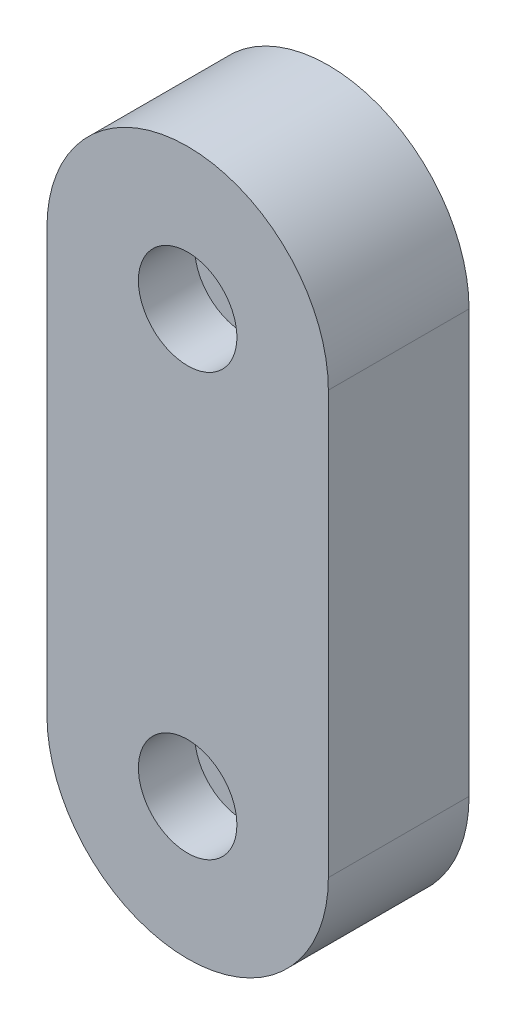
ISO-10303-21;
HEADER;
FILE_DESCRIPTION(('STEP AP214'),'2;1');
FILE_NAME('part.step','',(''),(''),'','','');
FILE_SCHEMA(('AUTOMOTIVE_DESIGN { 1 0 10303 214 1 1 1 1 }'));
ENDSEC;
DATA;
#1=APPLICATION_CONTEXT('core data for automotive mechanical design processes');
#2=APPLICATION_PROTOCOL_DEFINITION('international standard','automotive_design',2000,#1);
#3=PRODUCT_CONTEXT('',#1,'mechanical');
#4=PRODUCT('Part','Part','',(#3));
#5=PRODUCT_RELATED_PRODUCT_CATEGORY('part','',(#4));
#6=PRODUCT_DEFINITION_FORMATION('','',#4);
#7=PRODUCT_DEFINITION_CONTEXT('part definition',#1,'design');
#8=PRODUCT_DEFINITION('design','',#6,#7);
#9=PRODUCT_DEFINITION_SHAPE('','',#8);
#10=(LENGTH_UNIT() NAMED_UNIT(*) SI_UNIT(.MILLI.,.METRE.));
#11=(NAMED_UNIT(*) PLANE_ANGLE_UNIT() SI_UNIT($,.RADIAN.));
#12=(NAMED_UNIT(*) SI_UNIT($,.STERADIAN.) SOLID_ANGLE_UNIT());
#13=UNCERTAINTY_MEASURE_WITH_UNIT(LENGTH_MEASURE(1.E-05),#10,'distance_accuracy_value','');
#14=(GEOMETRIC_REPRESENTATION_CONTEXT(3) GLOBAL_UNCERTAINTY_ASSIGNED_CONTEXT((#13)) GLOBAL_UNIT_ASSIGNED_CONTEXT((#10,
#11,#12)) REPRESENTATION_CONTEXT('',''));
#15=CARTESIAN_POINT('',(0.,0.,0.));
#16=DIRECTION('',(0.,0.,1.));
#17=DIRECTION('',(1.,0.,0.));
#18=AXIS2_PLACEMENT_3D('',#15,#16,#17);
#19=CARTESIAN_POINT('',(0.,0.,10.));
#20=DIRECTION('',(0.,0.,-1.));
#21=DIRECTION('',(-1.,0.,0.));
#22=AXIS2_PLACEMENT_3D('',#19,#20,#21);
#23=CYLINDRICAL_SURFACE('',#22,10.);
#24=CARTESIAN_POINT('',(0.,0.,0.));
#25=DIRECTION('',(0.,0.,1.));
#26=DIRECTION('',(1.,0.,0.));
#27=AXIS2_PLACEMENT_3D('',#24,#25,#26);
#28=CIRCLE('',#27,10.);
#29=CARTESIAN_POINT('',(-10.,0.,0.));
#30=VERTEX_POINT('',#29);
#31=CARTESIAN_POINT('',(10.,0.,0.));
#32=VERTEX_POINT('',#31);
#33=EDGE_CURVE('E126',#30,#32,#28,.T.);
#34=ORIENTED_EDGE('',*,*,#33,.T.);
#35=DIRECTION('',(0.,0.,-1.));
#36=VECTOR('',#35,1.);
#37=CARTESIAN_POINT('',(10.,0.,10.));
#38=LINE('',#37,#36);
#39=CARTESIAN_POINT('',(10.,0.,10.));
#40=VERTEX_POINT('',#39);
#41=EDGE_CURVE('E12',#40,#32,#38,.T.);
#42=ORIENTED_EDGE('',*,*,#41,.F.);
#43=CARTESIAN_POINT('',(0.,0.,10.));
#44=DIRECTION('',(0.,0.,1.));
#45=DIRECTION('',(1.,0.,0.));
#46=AXIS2_PLACEMENT_3D('',#43,#44,#45);
#47=CIRCLE('',#46,10.);
#48=CARTESIAN_POINT('',(-10.,0.,10.));
#49=VERTEX_POINT('',#48);
#50=EDGE_CURVE('E92',#49,#40,#47,.T.);
#51=ORIENTED_EDGE('',*,*,#50,.F.);
#52=DIRECTION('',(0.,0.,-1.));
#53=VECTOR('',#52,1.);
#54=CARTESIAN_POINT('',(-10.,0.,10.));
#55=LINE('',#54,#53);
#56=EDGE_CURVE('E101',#49,#30,#55,.T.);
#57=ORIENTED_EDGE('',*,*,#56,.T.);
#58=EDGE_LOOP('',(#34,#42,#51,#57));
#59=FACE_BOUND('',#58,.T.);
#60=ADVANCED_FACE('F39',(#59),#23,.T.);
#61=CARTESIAN_POINT('',(10.,0.,10.));
#62=DIRECTION('',(-1.,0.,0.));
#63=DIRECTION('',(0.,0.,1.));
#64=AXIS2_PLACEMENT_3D('',#61,#62,#63);
#65=PLANE('',#64);
#66=DIRECTION('',(0.,1.,0.));
#67=VECTOR('',#66,1.);
#68=CARTESIAN_POINT('',(10.,0.,0.));
#69=LINE('',#68,#67);
#70=CARTESIAN_POINT('',(10.,30.,0.));
#71=VERTEX_POINT('',#70);
#72=EDGE_CURVE('E96',#32,#71,#69,.T.);
#73=ORIENTED_EDGE('',*,*,#72,.T.);
#74=DIRECTION('',(0.,0.,-1.));
#75=VECTOR('',#74,1.);
#76=CARTESIAN_POINT('',(10.,30.,10.));
#77=LINE('',#76,#75);
#78=CARTESIAN_POINT('',(10.,30.,10.));
#79=VERTEX_POINT('',#78);
#80=EDGE_CURVE('E48',#79,#71,#77,.T.);
#81=ORIENTED_EDGE('',*,*,#80,.F.);
#82=DIRECTION('',(0.,1.,0.));
#83=VECTOR('',#82,1.);
#84=CARTESIAN_POINT('',(10.,0.,10.));
#85=LINE('',#84,#83);
#86=EDGE_CURVE('E87',#40,#79,#85,.T.);
#87=ORIENTED_EDGE('',*,*,#86,.F.);
#88=ORIENTED_EDGE('',*,*,#41,.T.);
#89=EDGE_LOOP('',(#73,#81,#87,#88));
#90=FACE_BOUND('',#89,.T.);
#91=ADVANCED_FACE('F95',(#90),#65,.F.);
#92=CARTESIAN_POINT('',(0.,30.,10.));
#93=DIRECTION('',(0.,0.,-1.));
#94=DIRECTION('',(-1.,0.,0.));
#95=AXIS2_PLACEMENT_3D('',#92,#93,#94);
#96=CYLINDRICAL_SURFACE('',#95,10.);
#97=CARTESIAN_POINT('',(0.,30.,0.));
#98=DIRECTION('',(0.,0.,1.));
#99=DIRECTION('',(1.,0.,0.));
#100=AXIS2_PLACEMENT_3D('',#97,#98,#99);
#101=CIRCLE('',#100,10.);
#102=CARTESIAN_POINT('',(-10.,30.,0.));
#103=VERTEX_POINT('',#102);
#104=EDGE_CURVE('E74',#71,#103,#101,.T.);
#105=ORIENTED_EDGE('',*,*,#104,.T.);
#106=DIRECTION('',(0.,0.,-1.));
#107=VECTOR('',#106,1.);
#108=CARTESIAN_POINT('',(-10.,30.,10.));
#109=LINE('',#108,#107);
#110=CARTESIAN_POINT('',(-10.,30.,10.));
#111=VERTEX_POINT('',#110);
#112=EDGE_CURVE('E97',#111,#103,#109,.T.);
#113=ORIENTED_EDGE('',*,*,#112,.F.);
#114=CARTESIAN_POINT('',(0.,30.,10.));
#115=DIRECTION('',(0.,0.,1.));
#116=DIRECTION('',(1.,0.,0.));
#117=AXIS2_PLACEMENT_3D('',#114,#115,#116);
#118=CIRCLE('',#117,10.);
#119=EDGE_CURVE('E90',#79,#111,#118,.T.);
#120=ORIENTED_EDGE('',*,*,#119,.F.);
#121=ORIENTED_EDGE('',*,*,#80,.T.);
#122=EDGE_LOOP('',(#105,#113,#120,#121));
#123=FACE_BOUND('',#122,.T.);
#124=ADVANCED_FACE('F99',(#123),#96,.T.);
#125=CARTESIAN_POINT('',(-10.,0.,10.));
#126=DIRECTION('',(1.,0.,0.));
#127=DIRECTION('',(0.,0.,-1.));
#128=AXIS2_PLACEMENT_3D('',#125,#126,#127);
#129=PLANE('',#128);
#130=DIRECTION('',(0.,-1.,0.));
#131=VECTOR('',#130,1.);
#132=CARTESIAN_POINT('',(-10.,0.,0.));
#133=LINE('',#132,#131);
#134=EDGE_CURVE('E80',#103,#30,#133,.T.);
#135=ORIENTED_EDGE('',*,*,#134,.T.);
#136=ORIENTED_EDGE('',*,*,#56,.F.);
#137=DIRECTION('',(0.,-1.,0.));
#138=VECTOR('',#137,1.);
#139=CARTESIAN_POINT('',(-10.,0.,10.));
#140=LINE('',#139,#138);
#141=EDGE_CURVE('E57',#111,#49,#140,.T.);
#142=ORIENTED_EDGE('',*,*,#141,.F.);
#143=ORIENTED_EDGE('',*,*,#112,.T.);
#144=EDGE_LOOP('',(#135,#136,#142,#143));
#145=FACE_BOUND('',#144,.T.);
#146=ADVANCED_FACE('F170',(#145),#129,.F.);
#147=CARTESIAN_POINT('',(0.,0.,10.));
#148=DIRECTION('',(0.,0.,1.));
#149=DIRECTION('',(1.,0.,0.));
#150=AXIS2_PLACEMENT_3D('',#147,#148,#149);
#151=PLANE('',#150);
#152=CARTESIAN_POINT('',(0.,0.,10.));
#153=DIRECTION('',(0.,0.,1.));
#154=DIRECTION('',(1.,0.,0.));
#155=AXIS2_PLACEMENT_3D('',#152,#153,#154);
#156=CIRCLE('',#155,3.5);
#157=CARTESIAN_POINT('',(3.5,0.,10.));
#158=VERTEX_POINT('',#157);
#159=EDGE_CURVE('E127',#158,#158,#156,.T.);
#160=ORIENTED_EDGE('',*,*,#159,.F.);
#161=EDGE_LOOP('',(#160));
#162=FACE_BOUND('',#161,.T.);
#163=CARTESIAN_POINT('',(0.,30.,10.));
#164=DIRECTION('',(0.,0.,1.));
#165=DIRECTION('',(-1.,0.,0.));
#166=AXIS2_PLACEMENT_3D('',#163,#164,#165);
#167=CIRCLE('',#166,3.5);
#168=CARTESIAN_POINT('',(-3.5,30.,10.));
#169=VERTEX_POINT('',#168);
#170=EDGE_CURVE('E131',#169,#169,#167,.T.);
#171=ORIENTED_EDGE('',*,*,#170,.F.);
#172=EDGE_LOOP('',(#171));
#173=FACE_BOUND('',#172,.T.);
#174=ORIENTED_EDGE('',*,*,#50,.T.);
#175=ORIENTED_EDGE('',*,*,#86,.T.);
#176=ORIENTED_EDGE('',*,*,#119,.T.);
#177=ORIENTED_EDGE('',*,*,#141,.T.);
#178=EDGE_LOOP('',(#174,#175,#176,#177));
#179=FACE_BOUND('',#178,.T.);
#180=ADVANCED_FACE('F88',(#162,#173,#179),#151,.T.);
#181=CARTESIAN_POINT('',(0.,0.,0.));
#182=DIRECTION('',(0.,0.,1.));
#183=DIRECTION('',(1.,0.,0.));
#184=AXIS2_PLACEMENT_3D('',#181,#182,#183);
#185=PLANE('',#184);
#186=CARTESIAN_POINT('',(0.,0.,0.));
#187=DIRECTION('',(0.,0.,1.));
#188=DIRECTION('',(1.,0.,0.));
#189=AXIS2_PLACEMENT_3D('',#186,#187,#188);
#190=CIRCLE('',#189,1.55);
#191=CARTESIAN_POINT('',(1.55,0.,0.));
#192=VERTEX_POINT('',#191);
#193=EDGE_CURVE('E42',#192,#192,#190,.T.);
#194=ORIENTED_EDGE('',*,*,#193,.T.);
#195=EDGE_LOOP('',(#194));
#196=FACE_BOUND('',#195,.T.);
#197=CARTESIAN_POINT('',(0.,30.,0.));
#198=DIRECTION('',(0.,0.,1.));
#199=DIRECTION('',(1.,0.,0.));
#200=AXIS2_PLACEMENT_3D('',#197,#198,#199);
#201=CIRCLE('',#200,1.55);
#202=CARTESIAN_POINT('',(1.55,30.,0.));
#203=VERTEX_POINT('',#202);
#204=EDGE_CURVE('E143',#203,#203,#201,.T.);
#205=ORIENTED_EDGE('',*,*,#204,.T.);
#206=EDGE_LOOP('',(#205));
#207=FACE_BOUND('',#206,.T.);
#208=ORIENTED_EDGE('',*,*,#33,.F.);
#209=ORIENTED_EDGE('',*,*,#134,.F.);
#210=ORIENTED_EDGE('',*,*,#104,.F.);
#211=ORIENTED_EDGE('',*,*,#72,.F.);
#212=EDGE_LOOP('',(#208,#209,#210,#211));
#213=FACE_BOUND('',#212,.T.);
#214=ADVANCED_FACE('F159',(#196,#207,#213),#185,.F.);
#215=CARTESIAN_POINT('',(0.,30.,6.));
#216=DIRECTION('',(0.,0.,1.));
#217=DIRECTION('',(1.,0.,0.));
#218=AXIS2_PLACEMENT_3D('',#215,#216,#217);
#219=CYLINDRICAL_SURFACE('',#218,3.5);
#220=CARTESIAN_POINT('',(0.,30.,6.));
#221=DIRECTION('',(0.,0.,1.));
#222=DIRECTION('',(-1.,0.,0.));
#223=AXIS2_PLACEMENT_3D('',#220,#221,#222);
#224=CIRCLE('',#223,3.5);
#225=CARTESIAN_POINT('',(-3.5,30.,6.));
#226=VERTEX_POINT('',#225);
#227=EDGE_CURVE('E136',#226,#226,#224,.T.);
#228=ORIENTED_EDGE('',*,*,#227,.F.);
#229=EDGE_LOOP('',(#228));
#230=FACE_BOUND('',#229,.T.);
#231=ORIENTED_EDGE('',*,*,#170,.T.);
#232=EDGE_LOOP('',(#231));
#233=FACE_BOUND('',#232,.T.);
#234=ADVANCED_FACE('F161',(#230,#233),#219,.F.);
#235=CARTESIAN_POINT('',(0.,30.,6.));
#236=DIRECTION('',(0.,0.,-1.));
#237=DIRECTION('',(-1.,0.,0.));
#238=AXIS2_PLACEMENT_3D('',#235,#236,#237);
#239=PLANE('',#238);
#240=CARTESIAN_POINT('',(0.,30.,6.));
#241=DIRECTION('',(0.,0.,1.));
#242=DIRECTION('',(-1.,0.,0.));
#243=AXIS2_PLACEMENT_3D('',#240,#241,#242);
#244=CIRCLE('',#243,1.55);
#245=CARTESIAN_POINT('',(-1.55,30.,6.));
#246=VERTEX_POINT('',#245);
#247=EDGE_CURVE('E116',#246,#246,#244,.T.);
#248=ORIENTED_EDGE('',*,*,#247,.F.);
#249=EDGE_LOOP('',(#248));
#250=FACE_BOUND('',#249,.T.);
#251=ORIENTED_EDGE('',*,*,#227,.T.);
#252=EDGE_LOOP('',(#251));
#253=FACE_BOUND('',#252,.T.);
#254=ADVANCED_FACE('F167',(#250,#253),#239,.F.);
#255=CARTESIAN_POINT('',(0.,0.,6.));
#256=DIRECTION('',(0.,0.,1.));
#257=DIRECTION('',(1.,0.,0.));
#258=AXIS2_PLACEMENT_3D('',#255,#256,#257);
#259=CYLINDRICAL_SURFACE('',#258,3.5);
#260=CARTESIAN_POINT('',(0.,0.,6.));
#261=DIRECTION('',(0.,0.,1.));
#262=DIRECTION('',(1.,0.,0.));
#263=AXIS2_PLACEMENT_3D('',#260,#261,#262);
#264=CIRCLE('',#263,3.5);
#265=CARTESIAN_POINT('',(3.5,0.,6.));
#266=VERTEX_POINT('',#265);
#267=EDGE_CURVE('E122',#266,#266,#264,.T.);
#268=ORIENTED_EDGE('',*,*,#267,.F.);
#269=EDGE_LOOP('',(#268));
#270=FACE_BOUND('',#269,.T.);
#271=ORIENTED_EDGE('',*,*,#159,.T.);
#272=EDGE_LOOP('',(#271));
#273=FACE_BOUND('',#272,.T.);
#274=ADVANCED_FACE('F207',(#270,#273),#259,.F.);
#275=CARTESIAN_POINT('',(0.,0.,6.));
#276=DIRECTION('',(0.,0.,1.));
#277=DIRECTION('',(1.,0.,0.));
#278=AXIS2_PLACEMENT_3D('',#275,#276,#277);
#279=PLANE('',#278);
#280=CARTESIAN_POINT('',(0.,0.,6.));
#281=DIRECTION('',(0.,0.,1.));
#282=DIRECTION('',(1.,0.,0.));
#283=AXIS2_PLACEMENT_3D('',#280,#281,#282);
#284=CIRCLE('',#283,1.55);
#285=CARTESIAN_POINT('',(1.55,0.,6.));
#286=VERTEX_POINT('',#285);
#287=EDGE_CURVE('E120',#286,#286,#284,.T.);
#288=ORIENTED_EDGE('',*,*,#287,.F.);
#289=EDGE_LOOP('',(#288));
#290=FACE_BOUND('',#289,.T.);
#291=ORIENTED_EDGE('',*,*,#267,.T.);
#292=EDGE_LOOP('',(#291));
#293=FACE_BOUND('',#292,.T.);
#294=ADVANCED_FACE('F211',(#290,#293),#279,.T.);
#295=CARTESIAN_POINT('',(0.,30.,-16.));
#296=DIRECTION('',(0.,0.,1.));
#297=DIRECTION('',(1.,0.,0.));
#298=AXIS2_PLACEMENT_3D('',#295,#296,#297);
#299=CYLINDRICAL_SURFACE('',#298,1.55);
#300=ORIENTED_EDGE('',*,*,#247,.T.);
#301=EDGE_LOOP('',(#300));
#302=FACE_BOUND('',#301,.T.);
#303=ORIENTED_EDGE('',*,*,#204,.F.);
#304=EDGE_LOOP('',(#303));
#305=FACE_BOUND('',#304,.T.);
#306=ADVANCED_FACE('F235',(#302,#305),#299,.F.);
#307=CARTESIAN_POINT('',(0.,0.,-16.));
#308=DIRECTION('',(0.,0.,1.));
#309=DIRECTION('',(1.,0.,0.));
#310=AXIS2_PLACEMENT_3D('',#307,#308,#309);
#311=CYLINDRICAL_SURFACE('',#310,1.55);
#312=ORIENTED_EDGE('',*,*,#287,.T.);
#313=EDGE_LOOP('',(#312));
#314=FACE_BOUND('',#313,.T.);
#315=ORIENTED_EDGE('',*,*,#193,.F.);
#316=EDGE_LOOP('',(#315));
#317=FACE_BOUND('',#316,.T.);
#318=ADVANCED_FACE('F246',(#314,#317),#311,.F.);
#319=CLOSED_SHELL('',(#60,#91,#124,#146,#180,#214,#234,#254,#274,#294,#306,#318));
#320=MANIFOLD_SOLID_BREP('B2',#319);
#321=ADVANCED_BREP_SHAPE_REPRESENTATION('',(#18,#320),#14);
#322=SHAPE_DEFINITION_REPRESENTATION(#9,#321);
ENDSEC;
END-ISO-10303-21;
